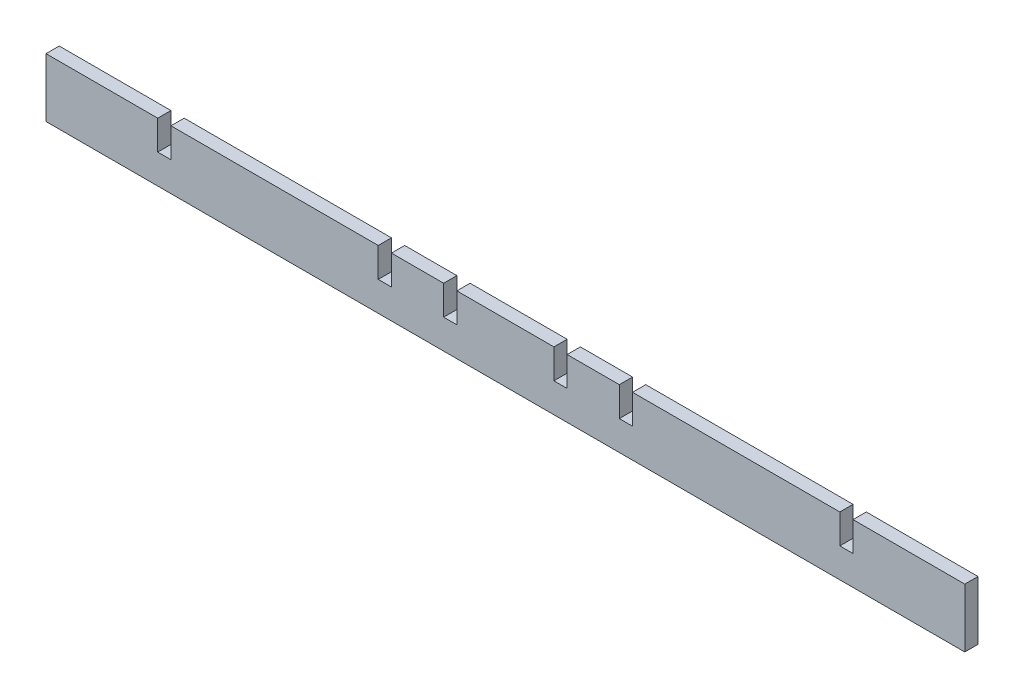
ISO-10303-21;
HEADER;
FILE_DESCRIPTION(('STEP AP214'),'2;1');
FILE_NAME('part.step','',(''),(''),'','','');
FILE_SCHEMA(('AUTOMOTIVE_DESIGN { 1 0 10303 214 1 1 1 1 }'));
ENDSEC;
DATA;
#1=APPLICATION_CONTEXT('core data for automotive mechanical design processes');
#2=APPLICATION_PROTOCOL_DEFINITION('international standard','automotive_design',2000,#1);
#3=PRODUCT_CONTEXT('',#1,'mechanical');
#4=PRODUCT('Part','Part','',(#3));
#5=PRODUCT_RELATED_PRODUCT_CATEGORY('part','',(#4));
#6=PRODUCT_DEFINITION_FORMATION('','',#4);
#7=PRODUCT_DEFINITION_CONTEXT('part definition',#1,'design');
#8=PRODUCT_DEFINITION('design','',#6,#7);
#9=PRODUCT_DEFINITION_SHAPE('','',#8);
#10=(LENGTH_UNIT() NAMED_UNIT(*) SI_UNIT(.MILLI.,.METRE.));
#11=(NAMED_UNIT(*) PLANE_ANGLE_UNIT() SI_UNIT($,.RADIAN.));
#12=(NAMED_UNIT(*) SI_UNIT($,.STERADIAN.) SOLID_ANGLE_UNIT());
#13=UNCERTAINTY_MEASURE_WITH_UNIT(LENGTH_MEASURE(1.E-05),#10,'distance_accuracy_value','');
#14=(GEOMETRIC_REPRESENTATION_CONTEXT(3) GLOBAL_UNCERTAINTY_ASSIGNED_CONTEXT((#13)) GLOBAL_UNIT_ASSIGNED_CONTEXT((#10,
#11,#12)) REPRESENTATION_CONTEXT('',''));
#15=CARTESIAN_POINT('',(0.,0.,0.));
#16=DIRECTION('',(0.,0.,1.));
#17=DIRECTION('',(1.,0.,0.));
#18=AXIS2_PLACEMENT_3D('',#15,#16,#17);
#19=CARTESIAN_POINT('',(473.,0.,18.));
#20=DIRECTION('',(-1.,0.,0.));
#21=DIRECTION('',(0.,0.,1.));
#22=AXIS2_PLACEMENT_3D('',#19,#20,#21);
#23=PLANE('',#22);
#24=DIRECTION('',(0.,1.,0.));
#25=VECTOR('',#24,1.);
#26=CARTESIAN_POINT('',(473.,0.,0.));
#27=LINE('',#26,#25);
#28=CARTESIAN_POINT('',(473.,0.,0.));
#29=VERTEX_POINT('',#28);
#30=CARTESIAN_POINT('',(473.,40.,0.));
#31=VERTEX_POINT('',#30);
#32=EDGE_CURVE('E251',#29,#31,#27,.T.);
#33=ORIENTED_EDGE('',*,*,#32,.F.);
#34=DIRECTION('',(0.,0.,-1.));
#35=VECTOR('',#34,1.);
#36=CARTESIAN_POINT('',(473.,0.,18.));
#37=LINE('',#36,#35);
#38=CARTESIAN_POINT('',(473.,0.,18.));
#39=VERTEX_POINT('',#38);
#40=EDGE_CURVE('E11',#39,#29,#37,.T.);
#41=ORIENTED_EDGE('',*,*,#40,.F.);
#42=DIRECTION('',(0.,1.,0.));
#43=VECTOR('',#42,1.);
#44=CARTESIAN_POINT('',(473.,0.,18.));
#45=LINE('',#44,#43);
#46=CARTESIAN_POINT('',(473.,40.,18.));
#47=VERTEX_POINT('',#46);
#48=EDGE_CURVE('E390',#39,#47,#45,.T.);
#49=ORIENTED_EDGE('',*,*,#48,.T.);
#50=DIRECTION('',(0.,0.,-1.));
#51=VECTOR('',#50,1.);
#52=CARTESIAN_POINT('',(473.,40.,18.));
#53=LINE('',#52,#51);
#54=EDGE_CURVE('E52',#47,#31,#53,.T.);
#55=ORIENTED_EDGE('',*,*,#54,.T.);
#56=EDGE_LOOP('',(#33,#41,#49,#55));
#57=FACE_BOUND('',#56,.T.);
#58=ADVANCED_FACE('F36',(#57),#23,.T.);
#59=CARTESIAN_POINT('',(0.,0.,18.));
#60=DIRECTION('',(0.,1.,0.));
#61=DIRECTION('',(0.,0.,1.));
#62=AXIS2_PLACEMENT_3D('',#59,#60,#61);
#63=PLANE('',#62);
#64=DIRECTION('',(1.,0.,0.));
#65=VECTOR('',#64,1.);
#66=CARTESIAN_POINT('',(0.,0.,0.));
#67=LINE('',#66,#65);
#68=CARTESIAN_POINT('',(455.,0.,0.));
#69=VERTEX_POINT('',#68);
#70=EDGE_CURVE('E253',#69,#29,#67,.T.);
#71=ORIENTED_EDGE('',*,*,#70,.F.);
#72=DIRECTION('',(0.,0.,-1.));
#73=VECTOR('',#72,1.);
#74=CARTESIAN_POINT('',(455.,0.,18.));
#75=LINE('',#74,#73);
#76=CARTESIAN_POINT('',(455.,0.,18.));
#77=VERTEX_POINT('',#76);
#78=EDGE_CURVE('E44',#77,#69,#75,.T.);
#79=ORIENTED_EDGE('',*,*,#78,.F.);
#80=DIRECTION('',(1.,0.,0.));
#81=VECTOR('',#80,1.);
#82=CARTESIAN_POINT('',(0.,0.,18.));
#83=LINE('',#82,#81);
#84=EDGE_CURVE('E386',#77,#39,#83,.T.);
#85=ORIENTED_EDGE('',*,*,#84,.T.);
#86=ORIENTED_EDGE('',*,*,#40,.T.);
#87=EDGE_LOOP('',(#71,#79,#85,#86));
#88=FACE_BOUND('',#87,.T.);
#89=ADVANCED_FACE('F375',(#88),#63,.T.);
#90=CARTESIAN_POINT('',(455.,0.,18.));
#91=DIRECTION('',(1.,0.,0.));
#92=DIRECTION('',(0.,0.,-1.));
#93=AXIS2_PLACEMENT_3D('',#90,#91,#92);
#94=PLANE('',#93);
#95=DIRECTION('',(0.,-1.,0.));
#96=VECTOR('',#95,1.);
#97=CARTESIAN_POINT('',(455.,0.,0.));
#98=LINE('',#97,#96);
#99=CARTESIAN_POINT('',(455.,40.,0.));
#100=VERTEX_POINT('',#99);
#101=EDGE_CURVE('E256',#100,#69,#98,.T.);
#102=ORIENTED_EDGE('',*,*,#101,.F.);
#103=DIRECTION('',(0.,0.,-1.));
#104=VECTOR('',#103,1.);
#105=CARTESIAN_POINT('',(455.,40.,18.));
#106=LINE('',#105,#104);
#107=CARTESIAN_POINT('',(455.,40.,18.));
#108=VERTEX_POINT('',#107);
#109=EDGE_CURVE('E364',#108,#100,#106,.T.);
#110=ORIENTED_EDGE('',*,*,#109,.F.);
#111=DIRECTION('',(0.,-1.,0.));
#112=VECTOR('',#111,1.);
#113=CARTESIAN_POINT('',(455.,0.,18.));
#114=LINE('',#113,#112);
#115=EDGE_CURVE('E371',#108,#77,#114,.T.);
#116=ORIENTED_EDGE('',*,*,#115,.T.);
#117=ORIENTED_EDGE('',*,*,#78,.T.);
#118=EDGE_LOOP('',(#102,#110,#116,#117));
#119=FACE_BOUND('',#118,.T.);
#120=ADVANCED_FACE('F369',(#119),#94,.T.);
#121=CARTESIAN_POINT('',(0.,40.,18.));
#122=DIRECTION('',(0.,1.,0.));
#123=DIRECTION('',(0.,0.,1.));
#124=AXIS2_PLACEMENT_3D('',#121,#122,#123);
#125=PLANE('',#124);
#126=DIRECTION('',(1.,0.,0.));
#127=VECTOR('',#126,1.);
#128=CARTESIAN_POINT('',(0.,40.,0.));
#129=LINE('',#128,#127);
#130=CARTESIAN_POINT('',(173.,40.,0.));
#131=VERTEX_POINT('',#130);
#132=EDGE_CURVE('E259',#131,#100,#129,.T.);
#133=ORIENTED_EDGE('',*,*,#132,.F.);
#134=DIRECTION('',(0.,0.,-1.));
#135=VECTOR('',#134,1.);
#136=CARTESIAN_POINT('',(173.,40.,18.));
#137=LINE('',#136,#135);
#138=CARTESIAN_POINT('',(173.,40.,18.));
#139=VERTEX_POINT('',#138);
#140=EDGE_CURVE('E362',#139,#131,#137,.T.);
#141=ORIENTED_EDGE('',*,*,#140,.F.);
#142=DIRECTION('',(1.,0.,0.));
#143=VECTOR('',#142,1.);
#144=CARTESIAN_POINT('',(0.,40.,18.));
#145=LINE('',#144,#143);
#146=EDGE_CURVE('E248',#139,#108,#145,.T.);
#147=ORIENTED_EDGE('',*,*,#146,.T.);
#148=ORIENTED_EDGE('',*,*,#109,.T.);
#149=EDGE_LOOP('',(#133,#141,#147,#148));
#150=FACE_BOUND('',#149,.T.);
#151=ADVANCED_FACE('F381',(#150),#125,.T.);
#152=CARTESIAN_POINT('',(173.,0.,18.));
#153=DIRECTION('',(-1.,0.,0.));
#154=DIRECTION('',(0.,0.,1.));
#155=AXIS2_PLACEMENT_3D('',#152,#153,#154);
#156=PLANE('',#155);
#157=DIRECTION('',(0.,1.,0.));
#158=VECTOR('',#157,1.);
#159=CARTESIAN_POINT('',(173.,0.,0.));
#160=LINE('',#159,#158);
#161=CARTESIAN_POINT('',(173.,0.,0.));
#162=VERTEX_POINT('',#161);
#163=EDGE_CURVE('E262',#162,#131,#160,.T.);
#164=ORIENTED_EDGE('',*,*,#163,.F.);
#165=DIRECTION('',(0.,0.,-1.));
#166=VECTOR('',#165,1.);
#167=CARTESIAN_POINT('',(173.,0.,18.));
#168=LINE('',#167,#166);
#169=CARTESIAN_POINT('',(173.,0.,18.));
#170=VERTEX_POINT('',#169);
#171=EDGE_CURVE('E360',#170,#162,#168,.T.);
#172=ORIENTED_EDGE('',*,*,#171,.F.);
#173=DIRECTION('',(0.,1.,0.));
#174=VECTOR('',#173,1.);
#175=CARTESIAN_POINT('',(173.,0.,18.));
#176=LINE('',#175,#174);
#177=EDGE_CURVE('E388',#170,#139,#176,.T.);
#178=ORIENTED_EDGE('',*,*,#177,.T.);
#179=ORIENTED_EDGE('',*,*,#140,.T.);
#180=EDGE_LOOP('',(#164,#172,#178,#179));
#181=FACE_BOUND('',#180,.T.);
#182=ADVANCED_FACE('F492',(#181),#156,.T.);
#183=CARTESIAN_POINT('',(0.,0.,18.));
#184=DIRECTION('',(0.,1.,0.));
#185=DIRECTION('',(0.,0.,1.));
#186=AXIS2_PLACEMENT_3D('',#183,#184,#185);
#187=PLANE('',#186);
#188=DIRECTION('',(1.,0.,0.));
#189=VECTOR('',#188,1.);
#190=CARTESIAN_POINT('',(0.,0.,0.));
#191=LINE('',#190,#189);
#192=CARTESIAN_POINT('',(155.,0.,0.));
#193=VERTEX_POINT('',#192);
#194=EDGE_CURVE('E267',#193,#162,#191,.T.);
#195=ORIENTED_EDGE('',*,*,#194,.F.);
#196=DIRECTION('',(0.,0.,-1.));
#197=VECTOR('',#196,1.);
#198=CARTESIAN_POINT('',(155.,0.,18.));
#199=LINE('',#198,#197);
#200=CARTESIAN_POINT('',(155.,0.,18.));
#201=VERTEX_POINT('',#200);
#202=EDGE_CURVE('E358',#201,#193,#199,.T.);
#203=ORIENTED_EDGE('',*,*,#202,.F.);
#204=DIRECTION('',(1.,0.,0.));
#205=VECTOR('',#204,1.);
#206=CARTESIAN_POINT('',(0.,0.,18.));
#207=LINE('',#206,#205);
#208=EDGE_CURVE('E395',#201,#170,#207,.T.);
#209=ORIENTED_EDGE('',*,*,#208,.T.);
#210=ORIENTED_EDGE('',*,*,#171,.T.);
#211=EDGE_LOOP('',(#195,#203,#209,#210));
#212=FACE_BOUND('',#211,.T.);
#213=ADVANCED_FACE('F508',(#212),#187,.T.);
#214=CARTESIAN_POINT('',(155.,0.,18.));
#215=DIRECTION('',(1.,0.,0.));
#216=DIRECTION('',(0.,0.,-1.));
#217=AXIS2_PLACEMENT_3D('',#214,#215,#216);
#218=PLANE('',#217);
#219=DIRECTION('',(0.,-1.,0.));
#220=VECTOR('',#219,1.);
#221=CARTESIAN_POINT('',(155.,0.,0.));
#222=LINE('',#221,#220);
#223=CARTESIAN_POINT('',(155.,40.,0.));
#224=VERTEX_POINT('',#223);
#225=EDGE_CURVE('E270',#224,#193,#222,.T.);
#226=ORIENTED_EDGE('',*,*,#225,.F.);
#227=DIRECTION('',(0.,0.,-1.));
#228=VECTOR('',#227,1.);
#229=CARTESIAN_POINT('',(155.,40.,18.));
#230=LINE('',#229,#228);
#231=CARTESIAN_POINT('',(155.,40.,18.));
#232=VERTEX_POINT('',#231);
#233=EDGE_CURVE('E356',#232,#224,#230,.T.);
#234=ORIENTED_EDGE('',*,*,#233,.F.);
#235=DIRECTION('',(0.,-1.,0.));
#236=VECTOR('',#235,1.);
#237=CARTESIAN_POINT('',(155.,0.,18.));
#238=LINE('',#237,#236);
#239=EDGE_CURVE('E398',#232,#201,#238,.T.);
#240=ORIENTED_EDGE('',*,*,#239,.T.);
#241=ORIENTED_EDGE('',*,*,#202,.T.);
#242=EDGE_LOOP('',(#226,#234,#240,#241));
#243=FACE_BOUND('',#242,.T.);
#244=ADVANCED_FACE('F512',(#243),#218,.T.);
#245=CARTESIAN_POINT('',(83.9999999999998,40.,0.));
#246=VERTEX_POINT('',#245);
#247=EDGE_CURVE('E264',#246,#224,#129,.T.);
#248=ORIENTED_EDGE('',*,*,#247,.F.);
#249=DIRECTION('',(0.,0.,-1.));
#250=VECTOR('',#249,1.);
#251=CARTESIAN_POINT('',(83.9999999999998,40.,18.));
#252=LINE('',#251,#250);
#253=CARTESIAN_POINT('',(83.9999999999998,40.,18.));
#254=VERTEX_POINT('',#253);
#255=EDGE_CURVE('E354',#254,#246,#252,.T.);
#256=ORIENTED_EDGE('',*,*,#255,.F.);
#257=EDGE_CURVE('E389',#254,#232,#145,.T.);
#258=ORIENTED_EDGE('',*,*,#257,.T.);
#259=ORIENTED_EDGE('',*,*,#233,.T.);
#260=EDGE_LOOP('',(#248,#256,#258,#259));
#261=FACE_BOUND('',#260,.T.);
#262=ADVANCED_FACE('F446',(#261),#125,.T.);
#263=CARTESIAN_POINT('',(83.9999999999998,0.,18.));
#264=DIRECTION('',(-1.,0.,0.));
#265=DIRECTION('',(0.,-1.,0.));
#266=AXIS2_PLACEMENT_3D('',#263,#264,#265);
#267=PLANE('',#266);
#268=DIRECTION('',(0.,1.,0.));
#269=VECTOR('',#268,1.);
#270=CARTESIAN_POINT('',(83.9999999999998,0.,0.));
#271=LINE('',#270,#269);
#272=CARTESIAN_POINT('',(83.9999999999998,0.,0.));
#273=VERTEX_POINT('',#272);
#274=EDGE_CURVE('E273',#273,#246,#271,.T.);
#275=ORIENTED_EDGE('',*,*,#274,.F.);
#276=DIRECTION('',(0.,0.,-1.));
#277=VECTOR('',#276,1.);
#278=CARTESIAN_POINT('',(83.9999999999998,0.,18.));
#279=LINE('',#278,#277);
#280=CARTESIAN_POINT('',(83.9999999999998,0.,18.));
#281=VERTEX_POINT('',#280);
#282=EDGE_CURVE('E352',#281,#273,#279,.T.);
#283=ORIENTED_EDGE('',*,*,#282,.F.);
#284=DIRECTION('',(0.,1.,0.));
#285=VECTOR('',#284,1.);
#286=CARTESIAN_POINT('',(83.9999999999998,0.,18.));
#287=LINE('',#286,#285);
#288=EDGE_CURVE('E401',#281,#254,#287,.T.);
#289=ORIENTED_EDGE('',*,*,#288,.T.);
#290=ORIENTED_EDGE('',*,*,#255,.T.);
#291=EDGE_LOOP('',(#275,#283,#289,#290));
#292=FACE_BOUND('',#291,.T.);
#293=ADVANCED_FACE('F454',(#292),#267,.T.);
#294=CARTESIAN_POINT('',(0.,0.,18.));
#295=DIRECTION('',(0.,1.,0.));
#296=DIRECTION('',(0.,0.,1.));
#297=AXIS2_PLACEMENT_3D('',#294,#295,#296);
#298=PLANE('',#297);
#299=DIRECTION('',(1.,0.,0.));
#300=VECTOR('',#299,1.);
#301=CARTESIAN_POINT('',(0.,0.,0.));
#302=LINE('',#301,#300);
#303=CARTESIAN_POINT('',(65.9999999999998,0.,0.));
#304=VERTEX_POINT('',#303);
#305=EDGE_CURVE('E276',#304,#273,#302,.T.);
#306=ORIENTED_EDGE('',*,*,#305,.F.);
#307=DIRECTION('',(0.,0.,-1.));
#308=VECTOR('',#307,1.);
#309=CARTESIAN_POINT('',(65.9999999999998,0.,18.));
#310=LINE('',#309,#308);
#311=CARTESIAN_POINT('',(65.9999999999998,0.,18.));
#312=VERTEX_POINT('',#311);
#313=EDGE_CURVE('E350',#312,#304,#310,.T.);
#314=ORIENTED_EDGE('',*,*,#313,.F.);
#315=DIRECTION('',(1.,0.,0.));
#316=VECTOR('',#315,1.);
#317=CARTESIAN_POINT('',(0.,0.,18.));
#318=LINE('',#317,#316);
#319=EDGE_CURVE('E404',#312,#281,#318,.T.);
#320=ORIENTED_EDGE('',*,*,#319,.T.);
#321=ORIENTED_EDGE('',*,*,#282,.T.);
#322=EDGE_LOOP('',(#306,#314,#320,#321));
#323=FACE_BOUND('',#322,.T.);
#324=ADVANCED_FACE('F457',(#323),#298,.T.);
#325=CARTESIAN_POINT('',(65.9999999999998,0.,18.));
#326=DIRECTION('',(1.,0.,0.));
#327=DIRECTION('',(0.,1.,0.));
#328=AXIS2_PLACEMENT_3D('',#325,#326,#327);
#329=PLANE('',#328);
#330=DIRECTION('',(0.,-1.,0.));
#331=VECTOR('',#330,1.);
#332=CARTESIAN_POINT('',(65.9999999999998,0.,0.));
#333=LINE('',#332,#331);
#334=CARTESIAN_POINT('',(65.9999999999998,40.,0.));
#335=VERTEX_POINT('',#334);
#336=EDGE_CURVE('E279',#335,#304,#333,.T.);
#337=ORIENTED_EDGE('',*,*,#336,.F.);
#338=DIRECTION('',(0.,0.,-1.));
#339=VECTOR('',#338,1.);
#340=CARTESIAN_POINT('',(65.9999999999998,40.,18.));
#341=LINE('',#340,#339);
#342=CARTESIAN_POINT('',(65.9999999999998,40.,18.));
#343=VERTEX_POINT('',#342);
#344=EDGE_CURVE('E348',#343,#335,#341,.T.);
#345=ORIENTED_EDGE('',*,*,#344,.F.);
#346=DIRECTION('',(0.,-1.,0.));
#347=VECTOR('',#346,1.);
#348=CARTESIAN_POINT('',(65.9999999999998,0.,18.));
#349=LINE('',#348,#347);
#350=EDGE_CURVE('E407',#343,#312,#349,.T.);
#351=ORIENTED_EDGE('',*,*,#350,.T.);
#352=ORIENTED_EDGE('',*,*,#313,.T.);
#353=EDGE_LOOP('',(#337,#345,#351,#352));
#354=FACE_BOUND('',#353,.T.);
#355=ADVANCED_FACE('F461',(#354),#329,.T.);
#356=CARTESIAN_POINT('',(-66.,40.,0.));
#357=VERTEX_POINT('',#356);
#358=EDGE_CURVE('E282',#357,#335,#129,.T.);
#359=ORIENTED_EDGE('',*,*,#358,.F.);
#360=DIRECTION('',(0.,0.,-1.));
#361=VECTOR('',#360,1.);
#362=CARTESIAN_POINT('',(-66.,40.,18.));
#363=LINE('',#362,#361);
#364=CARTESIAN_POINT('',(-66.,40.,18.));
#365=VERTEX_POINT('',#364);
#366=EDGE_CURVE('E346',#365,#357,#363,.T.);
#367=ORIENTED_EDGE('',*,*,#366,.F.);
#368=EDGE_CURVE('E410',#365,#343,#145,.T.);
#369=ORIENTED_EDGE('',*,*,#368,.T.);
#370=ORIENTED_EDGE('',*,*,#344,.T.);
#371=EDGE_LOOP('',(#359,#367,#369,#370));
#372=FACE_BOUND('',#371,.T.);
#373=ADVANCED_FACE('F464',(#372),#125,.T.);
#374=CARTESIAN_POINT('',(-66.,0.,18.));
#375=DIRECTION('',(1.,0.,0.));
#376=DIRECTION('',(0.,0.,-1.));
#377=AXIS2_PLACEMENT_3D('',#374,#375,#376);
#378=PLANE('',#377);
#379=DIRECTION('',(0.,-1.,0.));
#380=VECTOR('',#379,1.);
#381=CARTESIAN_POINT('',(-66.,0.,0.));
#382=LINE('',#381,#380);
#383=CARTESIAN_POINT('',(-66.,0.,0.));
#384=VERTEX_POINT('',#383);
#385=EDGE_CURVE('E283',#357,#384,#382,.T.);
#386=ORIENTED_EDGE('',*,*,#385,.T.);
#387=DIRECTION('',(0.,0.,-1.));
#388=VECTOR('',#387,1.);
#389=CARTESIAN_POINT('',(-66.,0.,18.));
#390=LINE('',#389,#388);
#391=CARTESIAN_POINT('',(-66.,0.,18.));
#392=VERTEX_POINT('',#391);
#393=EDGE_CURVE('E343',#392,#384,#390,.T.);
#394=ORIENTED_EDGE('',*,*,#393,.F.);
#395=DIRECTION('',(0.,-1.,0.));
#396=VECTOR('',#395,1.);
#397=CARTESIAN_POINT('',(-66.,0.,18.));
#398=LINE('',#397,#396);
#399=EDGE_CURVE('E411',#365,#392,#398,.T.);
#400=ORIENTED_EDGE('',*,*,#399,.F.);
#401=ORIENTED_EDGE('',*,*,#366,.T.);
#402=EDGE_LOOP('',(#386,#394,#400,#401));
#403=FACE_BOUND('',#402,.T.);
#404=ADVANCED_FACE('F523',(#403),#378,.F.);
#405=CARTESIAN_POINT('',(0.,0.,18.));
#406=DIRECTION('',(0.,-1.,0.));
#407=DIRECTION('',(0.,0.,-1.));
#408=AXIS2_PLACEMENT_3D('',#405,#406,#407);
#409=PLANE('',#408);
#410=DIRECTION('',(-1.,0.,0.));
#411=VECTOR('',#410,1.);
#412=CARTESIAN_POINT('',(0.,0.,0.));
#413=LINE('',#412,#411);
#414=CARTESIAN_POINT('',(-84.,0.,0.));
#415=VERTEX_POINT('',#414);
#416=EDGE_CURVE('E285',#384,#415,#413,.T.);
#417=ORIENTED_EDGE('',*,*,#416,.T.);
#418=DIRECTION('',(0.,0.,-1.));
#419=VECTOR('',#418,1.);
#420=CARTESIAN_POINT('',(-84.,0.,18.));
#421=LINE('',#420,#419);
#422=CARTESIAN_POINT('',(-84.,0.,18.));
#423=VERTEX_POINT('',#422);
#424=EDGE_CURVE('E340',#423,#415,#421,.T.);
#425=ORIENTED_EDGE('',*,*,#424,.F.);
#426=DIRECTION('',(-1.,0.,0.));
#427=VECTOR('',#426,1.);
#428=CARTESIAN_POINT('',(0.,0.,18.));
#429=LINE('',#428,#427);
#430=EDGE_CURVE('E413',#392,#423,#429,.T.);
#431=ORIENTED_EDGE('',*,*,#430,.F.);
#432=ORIENTED_EDGE('',*,*,#393,.T.);
#433=EDGE_LOOP('',(#417,#425,#431,#432));
#434=FACE_BOUND('',#433,.T.);
#435=ADVANCED_FACE('F526',(#434),#409,.F.);
#436=CARTESIAN_POINT('',(-84.,0.,18.));
#437=DIRECTION('',(-1.,0.,0.));
#438=DIRECTION('',(0.,0.,1.));
#439=AXIS2_PLACEMENT_3D('',#436,#437,#438);
#440=PLANE('',#439);
#441=DIRECTION('',(0.,1.,0.));
#442=VECTOR('',#441,1.);
#443=CARTESIAN_POINT('',(-84.,0.,0.));
#444=LINE('',#443,#442);
#445=CARTESIAN_POINT('',(-84.,40.,0.));
#446=VERTEX_POINT('',#445);
#447=EDGE_CURVE('E287',#415,#446,#444,.T.);
#448=ORIENTED_EDGE('',*,*,#447,.T.);
#449=DIRECTION('',(0.,0.,-1.));
#450=VECTOR('',#449,1.);
#451=CARTESIAN_POINT('',(-84.,40.,18.));
#452=LINE('',#451,#450);
#453=CARTESIAN_POINT('',(-84.,40.,18.));
#454=VERTEX_POINT('',#453);
#455=EDGE_CURVE('E338',#454,#446,#452,.T.);
#456=ORIENTED_EDGE('',*,*,#455,.F.);
#457=DIRECTION('',(0.,1.,0.));
#458=VECTOR('',#457,1.);
#459=CARTESIAN_POINT('',(-84.,0.,18.));
#460=LINE('',#459,#458);
#461=EDGE_CURVE('E415',#423,#454,#460,.T.);
#462=ORIENTED_EDGE('',*,*,#461,.F.);
#463=ORIENTED_EDGE('',*,*,#424,.T.);
#464=EDGE_LOOP('',(#448,#456,#462,#463));
#465=FACE_BOUND('',#464,.T.);
#466=ADVANCED_FACE('F530',(#465),#440,.F.);
#467=CARTESIAN_POINT('',(-155.,40.,0.));
#468=VERTEX_POINT('',#467);
#469=EDGE_CURVE('E290',#468,#446,#129,.T.);
#470=ORIENTED_EDGE('',*,*,#469,.F.);
#471=DIRECTION('',(0.,0.,-1.));
#472=VECTOR('',#471,1.);
#473=CARTESIAN_POINT('',(-155.,40.,18.));
#474=LINE('',#473,#472);
#475=CARTESIAN_POINT('',(-155.,40.,18.));
#476=VERTEX_POINT('',#475);
#477=EDGE_CURVE('E336',#476,#468,#474,.T.);
#478=ORIENTED_EDGE('',*,*,#477,.F.);
#479=EDGE_CURVE('E417',#476,#454,#145,.T.);
#480=ORIENTED_EDGE('',*,*,#479,.T.);
#481=ORIENTED_EDGE('',*,*,#455,.T.);
#482=EDGE_LOOP('',(#470,#478,#480,#481));
#483=FACE_BOUND('',#482,.T.);
#484=ADVANCED_FACE('F534',(#483),#125,.T.);
#485=CARTESIAN_POINT('',(-155.,0.,18.));
#486=DIRECTION('',(1.,0.,0.));
#487=DIRECTION('',(0.,0.,-1.));
#488=AXIS2_PLACEMENT_3D('',#485,#486,#487);
#489=PLANE('',#488);
#490=DIRECTION('',(0.,-1.,0.));
#491=VECTOR('',#490,1.);
#492=CARTESIAN_POINT('',(-155.,0.,0.));
#493=LINE('',#492,#491);
#494=CARTESIAN_POINT('',(-155.,0.,0.));
#495=VERTEX_POINT('',#494);
#496=EDGE_CURVE('E291',#468,#495,#493,.T.);
#497=ORIENTED_EDGE('',*,*,#496,.T.);
#498=DIRECTION('',(0.,0.,-1.));
#499=VECTOR('',#498,1.);
#500=CARTESIAN_POINT('',(-155.,0.,18.));
#501=LINE('',#500,#499);
#502=CARTESIAN_POINT('',(-155.,0.,18.));
#503=VERTEX_POINT('',#502);
#504=EDGE_CURVE('E333',#503,#495,#501,.T.);
#505=ORIENTED_EDGE('',*,*,#504,.F.);
#506=DIRECTION('',(0.,-1.,0.));
#507=VECTOR('',#506,1.);
#508=CARTESIAN_POINT('',(-155.,0.,18.));
#509=LINE('',#508,#507);
#510=EDGE_CURVE('E418',#476,#503,#509,.T.);
#511=ORIENTED_EDGE('',*,*,#510,.F.);
#512=ORIENTED_EDGE('',*,*,#477,.T.);
#513=EDGE_LOOP('',(#497,#505,#511,#512));
#514=FACE_BOUND('',#513,.T.);
#515=ADVANCED_FACE('F536',(#514),#489,.F.);
#516=CARTESIAN_POINT('',(0.,0.,18.));
#517=DIRECTION('',(0.,-1.,0.));
#518=DIRECTION('',(0.,0.,-1.));
#519=AXIS2_PLACEMENT_3D('',#516,#517,#518);
#520=PLANE('',#519);
#521=DIRECTION('',(-1.,0.,0.));
#522=VECTOR('',#521,1.);
#523=CARTESIAN_POINT('',(0.,0.,0.));
#524=LINE('',#523,#522);
#525=CARTESIAN_POINT('',(-173.,0.,0.));
#526=VERTEX_POINT('',#525);
#527=EDGE_CURVE('E293',#495,#526,#524,.T.);
#528=ORIENTED_EDGE('',*,*,#527,.T.);
#529=DIRECTION('',(0.,0.,-1.));
#530=VECTOR('',#529,1.);
#531=CARTESIAN_POINT('',(-173.,0.,18.));
#532=LINE('',#531,#530);
#533=CARTESIAN_POINT('',(-173.,0.,18.));
#534=VERTEX_POINT('',#533);
#535=EDGE_CURVE('E330',#534,#526,#532,.T.);
#536=ORIENTED_EDGE('',*,*,#535,.F.);
#537=DIRECTION('',(-1.,0.,0.));
#538=VECTOR('',#537,1.);
#539=CARTESIAN_POINT('',(0.,0.,18.));
#540=LINE('',#539,#538);
#541=EDGE_CURVE('E420',#503,#534,#540,.T.);
#542=ORIENTED_EDGE('',*,*,#541,.F.);
#543=ORIENTED_EDGE('',*,*,#504,.T.);
#544=EDGE_LOOP('',(#528,#536,#542,#543));
#545=FACE_BOUND('',#544,.T.);
#546=ADVANCED_FACE('F539',(#545),#520,.F.);
#547=CARTESIAN_POINT('',(-173.,0.,18.));
#548=DIRECTION('',(-1.,0.,0.));
#549=DIRECTION('',(0.,0.,1.));
#550=AXIS2_PLACEMENT_3D('',#547,#548,#549);
#551=PLANE('',#550);
#552=DIRECTION('',(0.,1.,0.));
#553=VECTOR('',#552,1.);
#554=CARTESIAN_POINT('',(-173.,0.,0.));
#555=LINE('',#554,#553);
#556=CARTESIAN_POINT('',(-173.,40.,0.));
#557=VERTEX_POINT('',#556);
#558=EDGE_CURVE('E295',#526,#557,#555,.T.);
#559=ORIENTED_EDGE('',*,*,#558,.T.);
#560=DIRECTION('',(0.,0.,-1.));
#561=VECTOR('',#560,1.);
#562=CARTESIAN_POINT('',(-173.,40.,18.));
#563=LINE('',#562,#561);
#564=CARTESIAN_POINT('',(-173.,40.,18.));
#565=VERTEX_POINT('',#564);
#566=EDGE_CURVE('E328',#565,#557,#563,.T.);
#567=ORIENTED_EDGE('',*,*,#566,.F.);
#568=DIRECTION('',(0.,1.,0.));
#569=VECTOR('',#568,1.);
#570=CARTESIAN_POINT('',(-173.,0.,18.));
#571=LINE('',#570,#569);
#572=EDGE_CURVE('E422',#534,#565,#571,.T.);
#573=ORIENTED_EDGE('',*,*,#572,.F.);
#574=ORIENTED_EDGE('',*,*,#535,.T.);
#575=EDGE_LOOP('',(#559,#567,#573,#574));
#576=FACE_BOUND('',#575,.T.);
#577=ADVANCED_FACE('F543',(#576),#551,.F.);
#578=CARTESIAN_POINT('',(-455.,40.,0.));
#579=VERTEX_POINT('',#578);
#580=EDGE_CURVE('E298',#579,#557,#129,.T.);
#581=ORIENTED_EDGE('',*,*,#580,.F.);
#582=DIRECTION('',(0.,0.,-1.));
#583=VECTOR('',#582,1.);
#584=CARTESIAN_POINT('',(-455.,40.,18.));
#585=LINE('',#584,#583);
#586=CARTESIAN_POINT('',(-455.,40.,18.));
#587=VERTEX_POINT('',#586);
#588=EDGE_CURVE('E326',#587,#579,#585,.T.);
#589=ORIENTED_EDGE('',*,*,#588,.F.);
#590=EDGE_CURVE('E424',#587,#565,#145,.T.);
#591=ORIENTED_EDGE('',*,*,#590,.T.);
#592=ORIENTED_EDGE('',*,*,#566,.T.);
#593=EDGE_LOOP('',(#581,#589,#591,#592));
#594=FACE_BOUND('',#593,.T.);
#595=ADVANCED_FACE('F496',(#594),#125,.T.);
#596=CARTESIAN_POINT('',(-455.,0.,18.));
#597=DIRECTION('',(1.,0.,0.));
#598=DIRECTION('',(0.,0.,-1.));
#599=AXIS2_PLACEMENT_3D('',#596,#597,#598);
#600=PLANE('',#599);
#601=DIRECTION('',(0.,-1.,0.));
#602=VECTOR('',#601,1.);
#603=CARTESIAN_POINT('',(-455.,0.,0.));
#604=LINE('',#603,#602);
#605=CARTESIAN_POINT('',(-455.,0.,0.));
#606=VERTEX_POINT('',#605);
#607=EDGE_CURVE('E299',#579,#606,#604,.T.);
#608=ORIENTED_EDGE('',*,*,#607,.T.);
#609=DIRECTION('',(0.,0.,-1.));
#610=VECTOR('',#609,1.);
#611=CARTESIAN_POINT('',(-455.,0.,18.));
#612=LINE('',#611,#610);
#613=CARTESIAN_POINT('',(-455.,0.,18.));
#614=VERTEX_POINT('',#613);
#615=EDGE_CURVE('E323',#614,#606,#612,.T.);
#616=ORIENTED_EDGE('',*,*,#615,.F.);
#617=DIRECTION('',(0.,-1.,0.));
#618=VECTOR('',#617,1.);
#619=CARTESIAN_POINT('',(-455.,0.,18.));
#620=LINE('',#619,#618);
#621=EDGE_CURVE('E425',#587,#614,#620,.T.);
#622=ORIENTED_EDGE('',*,*,#621,.F.);
#623=ORIENTED_EDGE('',*,*,#588,.T.);
#624=EDGE_LOOP('',(#608,#616,#622,#623));
#625=FACE_BOUND('',#624,.T.);
#626=ADVANCED_FACE('F548',(#625),#600,.F.);
#627=CARTESIAN_POINT('',(0.,0.,18.));
#628=DIRECTION('',(0.,-1.,0.));
#629=DIRECTION('',(0.,0.,-1.));
#630=AXIS2_PLACEMENT_3D('',#627,#628,#629);
#631=PLANE('',#630);
#632=DIRECTION('',(-1.,0.,0.));
#633=VECTOR('',#632,1.);
#634=CARTESIAN_POINT('',(0.,0.,0.));
#635=LINE('',#634,#633);
#636=CARTESIAN_POINT('',(-473.,0.,0.));
#637=VERTEX_POINT('',#636);
#638=EDGE_CURVE('E301',#606,#637,#635,.T.);
#639=ORIENTED_EDGE('',*,*,#638,.T.);
#640=DIRECTION('',(0.,0.,-1.));
#641=VECTOR('',#640,1.);
#642=CARTESIAN_POINT('',(-473.,0.,18.));
#643=LINE('',#642,#641);
#644=CARTESIAN_POINT('',(-473.,0.,18.));
#645=VERTEX_POINT('',#644);
#646=EDGE_CURVE('E320',#645,#637,#643,.T.);
#647=ORIENTED_EDGE('',*,*,#646,.F.);
#648=DIRECTION('',(-1.,0.,0.));
#649=VECTOR('',#648,1.);
#650=CARTESIAN_POINT('',(0.,0.,18.));
#651=LINE('',#650,#649);
#652=EDGE_CURVE('E427',#614,#645,#651,.T.);
#653=ORIENTED_EDGE('',*,*,#652,.F.);
#654=ORIENTED_EDGE('',*,*,#615,.T.);
#655=EDGE_LOOP('',(#639,#647,#653,#654));
#656=FACE_BOUND('',#655,.T.);
#657=ADVANCED_FACE('F551',(#656),#631,.F.);
#658=CARTESIAN_POINT('',(-473.,0.,18.));
#659=DIRECTION('',(-1.,0.,0.));
#660=DIRECTION('',(0.,0.,1.));
#661=AXIS2_PLACEMENT_3D('',#658,#659,#660);
#662=PLANE('',#661);
#663=DIRECTION('',(0.,1.,0.));
#664=VECTOR('',#663,1.);
#665=CARTESIAN_POINT('',(-473.,0.,0.));
#666=LINE('',#665,#664);
#667=CARTESIAN_POINT('',(-473.,40.,0.));
#668=VERTEX_POINT('',#667);
#669=EDGE_CURVE('E303',#637,#668,#666,.T.);
#670=ORIENTED_EDGE('',*,*,#669,.T.);
#671=DIRECTION('',(0.,0.,-1.));
#672=VECTOR('',#671,1.);
#673=CARTESIAN_POINT('',(-473.,40.,18.));
#674=LINE('',#673,#672);
#675=CARTESIAN_POINT('',(-473.,40.,18.));
#676=VERTEX_POINT('',#675);
#677=EDGE_CURVE('E318',#676,#668,#674,.T.);
#678=ORIENTED_EDGE('',*,*,#677,.F.);
#679=DIRECTION('',(0.,1.,0.));
#680=VECTOR('',#679,1.);
#681=CARTESIAN_POINT('',(-473.,0.,18.));
#682=LINE('',#681,#680);
#683=EDGE_CURVE('E429',#645,#676,#682,.T.);
#684=ORIENTED_EDGE('',*,*,#683,.F.);
#685=ORIENTED_EDGE('',*,*,#646,.T.);
#686=EDGE_LOOP('',(#670,#678,#684,#685));
#687=FACE_BOUND('',#686,.T.);
#688=ADVANCED_FACE('F495',(#687),#662,.F.);
#689=CARTESIAN_POINT('',(-625.,40.,0.));
#690=VERTEX_POINT('',#689);
#691=EDGE_CURVE('E306',#690,#668,#129,.T.);
#692=ORIENTED_EDGE('',*,*,#691,.F.);
#693=DIRECTION('',(0.,0.,-1.));
#694=VECTOR('',#693,1.);
#695=CARTESIAN_POINT('',(-625.,40.,18.));
#696=LINE('',#695,#694);
#697=CARTESIAN_POINT('',(-625.,40.,18.));
#698=VERTEX_POINT('',#697);
#699=EDGE_CURVE('E316',#698,#690,#696,.T.);
#700=ORIENTED_EDGE('',*,*,#699,.F.);
#701=EDGE_CURVE('E247',#698,#676,#145,.T.);
#702=ORIENTED_EDGE('',*,*,#701,.T.);
#703=ORIENTED_EDGE('',*,*,#677,.T.);
#704=EDGE_LOOP('',(#692,#700,#702,#703));
#705=FACE_BOUND('',#704,.T.);
#706=ADVANCED_FACE('F483',(#705),#125,.T.);
#707=CARTESIAN_POINT('',(-625.,0.,18.));
#708=DIRECTION('',(-1.,0.,0.));
#709=DIRECTION('',(0.,0.,1.));
#710=AXIS2_PLACEMENT_3D('',#707,#708,#709);
#711=PLANE('',#710);
#712=DIRECTION('',(0.,1.,0.));
#713=VECTOR('',#712,1.);
#714=CARTESIAN_POINT('',(-625.,0.,0.));
#715=LINE('',#714,#713);
#716=CARTESIAN_POINT('',(-625.,-40.,0.));
#717=VERTEX_POINT('',#716);
#718=EDGE_CURVE('E307',#717,#690,#715,.T.);
#719=ORIENTED_EDGE('',*,*,#718,.F.);
#720=DIRECTION('',(0.,0.,-1.));
#721=VECTOR('',#720,1.);
#722=CARTESIAN_POINT('',(-625.,-40.,18.));
#723=LINE('',#722,#721);
#724=CARTESIAN_POINT('',(-625.,-40.,18.));
#725=VERTEX_POINT('',#724);
#726=EDGE_CURVE('E241',#725,#717,#723,.T.);
#727=ORIENTED_EDGE('',*,*,#726,.F.);
#728=DIRECTION('',(0.,1.,0.));
#729=VECTOR('',#728,1.);
#730=CARTESIAN_POINT('',(-625.,0.,18.));
#731=LINE('',#730,#729);
#732=EDGE_CURVE('E231',#725,#698,#731,.T.);
#733=ORIENTED_EDGE('',*,*,#732,.T.);
#734=ORIENTED_EDGE('',*,*,#699,.T.);
#735=EDGE_LOOP('',(#719,#727,#733,#734));
#736=FACE_BOUND('',#735,.T.);
#737=ADVANCED_FACE('F494',(#736),#711,.T.);
#738=CARTESIAN_POINT('',(0.,-40.,18.));
#739=DIRECTION('',(0.,1.,0.));
#740=DIRECTION('',(-1.,0.,0.));
#741=AXIS2_PLACEMENT_3D('',#738,#739,#740);
#742=PLANE('',#741);
#743=DIRECTION('',(1.,0.,0.));
#744=VECTOR('',#743,1.);
#745=CARTESIAN_POINT('',(0.,-40.,0.));
#746=LINE('',#745,#744);
#747=CARTESIAN_POINT('',(625.,-40.,0.));
#748=VERTEX_POINT('',#747);
#749=EDGE_CURVE('E238',#717,#748,#746,.T.);
#750=ORIENTED_EDGE('',*,*,#749,.T.);
#751=DIRECTION('',(0.,0.,-1.));
#752=VECTOR('',#751,1.);
#753=CARTESIAN_POINT('',(625.,-40.,18.));
#754=LINE('',#753,#752);
#755=CARTESIAN_POINT('',(625.,-40.,18.));
#756=VERTEX_POINT('',#755);
#757=EDGE_CURVE('E235',#756,#748,#754,.T.);
#758=ORIENTED_EDGE('',*,*,#757,.F.);
#759=DIRECTION('',(1.,0.,0.));
#760=VECTOR('',#759,1.);
#761=CARTESIAN_POINT('',(0.,-40.,18.));
#762=LINE('',#761,#760);
#763=EDGE_CURVE('E223',#725,#756,#762,.T.);
#764=ORIENTED_EDGE('',*,*,#763,.F.);
#765=ORIENTED_EDGE('',*,*,#726,.T.);
#766=EDGE_LOOP('',(#750,#758,#764,#765));
#767=FACE_BOUND('',#766,.T.);
#768=ADVANCED_FACE('F236',(#767),#742,.F.);
#769=CARTESIAN_POINT('',(625.,0.,18.));
#770=DIRECTION('',(-1.,0.,0.));
#771=DIRECTION('',(0.,0.,1.));
#772=AXIS2_PLACEMENT_3D('',#769,#770,#771);
#773=PLANE('',#772);
#774=DIRECTION('',(0.,1.,0.));
#775=VECTOR('',#774,1.);
#776=CARTESIAN_POINT('',(625.,0.,0.));
#777=LINE('',#776,#775);
#778=CARTESIAN_POINT('',(625.,40.,0.));
#779=VERTEX_POINT('',#778);
#780=EDGE_CURVE('E311',#748,#779,#777,.T.);
#781=ORIENTED_EDGE('',*,*,#780,.T.);
#782=DIRECTION('',(0.,0.,-1.));
#783=VECTOR('',#782,1.);
#784=CARTESIAN_POINT('',(625.,40.,18.));
#785=LINE('',#784,#783);
#786=CARTESIAN_POINT('',(625.,40.,18.));
#787=VERTEX_POINT('',#786);
#788=EDGE_CURVE('E138',#787,#779,#785,.T.);
#789=ORIENTED_EDGE('',*,*,#788,.F.);
#790=DIRECTION('',(0.,1.,0.));
#791=VECTOR('',#790,1.);
#792=CARTESIAN_POINT('',(625.,0.,18.));
#793=LINE('',#792,#791);
#794=EDGE_CURVE('E228',#756,#787,#793,.T.);
#795=ORIENTED_EDGE('',*,*,#794,.F.);
#796=ORIENTED_EDGE('',*,*,#757,.T.);
#797=EDGE_LOOP('',(#781,#789,#795,#796));
#798=FACE_BOUND('',#797,.T.);
#799=ADVANCED_FACE('F243',(#798),#773,.F.);
#800=EDGE_CURVE('E263',#31,#779,#129,.T.);
#801=ORIENTED_EDGE('',*,*,#800,.F.);
#802=ORIENTED_EDGE('',*,*,#54,.F.);
#803=EDGE_CURVE('E244',#47,#787,#145,.T.);
#804=ORIENTED_EDGE('',*,*,#803,.T.);
#805=ORIENTED_EDGE('',*,*,#788,.T.);
#806=EDGE_LOOP('',(#801,#802,#804,#805));
#807=FACE_BOUND('',#806,.T.);
#808=ADVANCED_FACE('F480',(#807),#125,.T.);
#809=CARTESIAN_POINT('',(0.,0.,18.));
#810=DIRECTION('',(0.,0.,1.));
#811=DIRECTION('',(1.,0.,0.));
#812=AXIS2_PLACEMENT_3D('',#809,#810,#811);
#813=PLANE('',#812);
#814=ORIENTED_EDGE('',*,*,#48,.F.);
#815=ORIENTED_EDGE('',*,*,#84,.F.);
#816=ORIENTED_EDGE('',*,*,#115,.F.);
#817=ORIENTED_EDGE('',*,*,#146,.F.);
#818=ORIENTED_EDGE('',*,*,#177,.F.);
#819=ORIENTED_EDGE('',*,*,#208,.F.);
#820=ORIENTED_EDGE('',*,*,#239,.F.);
#821=ORIENTED_EDGE('',*,*,#257,.F.);
#822=ORIENTED_EDGE('',*,*,#288,.F.);
#823=ORIENTED_EDGE('',*,*,#319,.F.);
#824=ORIENTED_EDGE('',*,*,#350,.F.);
#825=ORIENTED_EDGE('',*,*,#368,.F.);
#826=ORIENTED_EDGE('',*,*,#399,.T.);
#827=ORIENTED_EDGE('',*,*,#430,.T.);
#828=ORIENTED_EDGE('',*,*,#461,.T.);
#829=ORIENTED_EDGE('',*,*,#479,.F.);
#830=ORIENTED_EDGE('',*,*,#510,.T.);
#831=ORIENTED_EDGE('',*,*,#541,.T.);
#832=ORIENTED_EDGE('',*,*,#572,.T.);
#833=ORIENTED_EDGE('',*,*,#590,.F.);
#834=ORIENTED_EDGE('',*,*,#621,.T.);
#835=ORIENTED_EDGE('',*,*,#652,.T.);
#836=ORIENTED_EDGE('',*,*,#683,.T.);
#837=ORIENTED_EDGE('',*,*,#701,.F.);
#838=ORIENTED_EDGE('',*,*,#732,.F.);
#839=ORIENTED_EDGE('',*,*,#763,.T.);
#840=ORIENTED_EDGE('',*,*,#794,.T.);
#841=ORIENTED_EDGE('',*,*,#803,.F.);
#842=EDGE_LOOP('',(#814,#815,#816,#817,#818,#819,#820,#821,#822,#823,#824,#825,#826,#827,#828,
#829,#830,#831,#832,#833,#834,#835,#836,#837,#838,#839,#840,#841));
#843=FACE_BOUND('',#842,.T.);
#844=ADVANCED_FACE('F225',(#843),#813,.T.);
#845=CARTESIAN_POINT('',(0.,0.,0.));
#846=DIRECTION('',(0.,0.,1.));
#847=DIRECTION('',(1.,0.,0.));
#848=AXIS2_PLACEMENT_3D('',#845,#846,#847);
#849=PLANE('',#848);
#850=ORIENTED_EDGE('',*,*,#32,.T.);
#851=ORIENTED_EDGE('',*,*,#800,.T.);
#852=ORIENTED_EDGE('',*,*,#780,.F.);
#853=ORIENTED_EDGE('',*,*,#749,.F.);
#854=ORIENTED_EDGE('',*,*,#718,.T.);
#855=ORIENTED_EDGE('',*,*,#691,.T.);
#856=ORIENTED_EDGE('',*,*,#669,.F.);
#857=ORIENTED_EDGE('',*,*,#638,.F.);
#858=ORIENTED_EDGE('',*,*,#607,.F.);
#859=ORIENTED_EDGE('',*,*,#580,.T.);
#860=ORIENTED_EDGE('',*,*,#558,.F.);
#861=ORIENTED_EDGE('',*,*,#527,.F.);
#862=ORIENTED_EDGE('',*,*,#496,.F.);
#863=ORIENTED_EDGE('',*,*,#469,.T.);
#864=ORIENTED_EDGE('',*,*,#447,.F.);
#865=ORIENTED_EDGE('',*,*,#416,.F.);
#866=ORIENTED_EDGE('',*,*,#385,.F.);
#867=ORIENTED_EDGE('',*,*,#358,.T.);
#868=ORIENTED_EDGE('',*,*,#336,.T.);
#869=ORIENTED_EDGE('',*,*,#305,.T.);
#870=ORIENTED_EDGE('',*,*,#274,.T.);
#871=ORIENTED_EDGE('',*,*,#247,.T.);
#872=ORIENTED_EDGE('',*,*,#225,.T.);
#873=ORIENTED_EDGE('',*,*,#194,.T.);
#874=ORIENTED_EDGE('',*,*,#163,.T.);
#875=ORIENTED_EDGE('',*,*,#132,.T.);
#876=ORIENTED_EDGE('',*,*,#101,.T.);
#877=ORIENTED_EDGE('',*,*,#70,.T.);
#878=EDGE_LOOP('',(#850,#851,#852,#853,#854,#855,#856,#857,#858,#859,#860,#861,#862,#863,#864,
#865,#866,#867,#868,#869,#870,#871,#872,#873,#874,#875,#876,#877));
#879=FACE_BOUND('',#878,.T.);
#880=ADVANCED_FACE('F377',(#879),#849,.F.);
#881=CLOSED_SHELL('',(#58,#89,#120,#151,#182,#213,#244,#262,#293,#324,#355,#373,#404,#435,#466,
#484,#515,#546,#577,#595,#626,#657,#688,#706,#737,#768,#799,#808,#844,#880));
#882=MANIFOLD_SOLID_BREP('B2',#881);
#883=ADVANCED_BREP_SHAPE_REPRESENTATION('',(#18,#882),#14);
#884=SHAPE_DEFINITION_REPRESENTATION(#9,#883);
ENDSEC;
END-ISO-10303-21;
